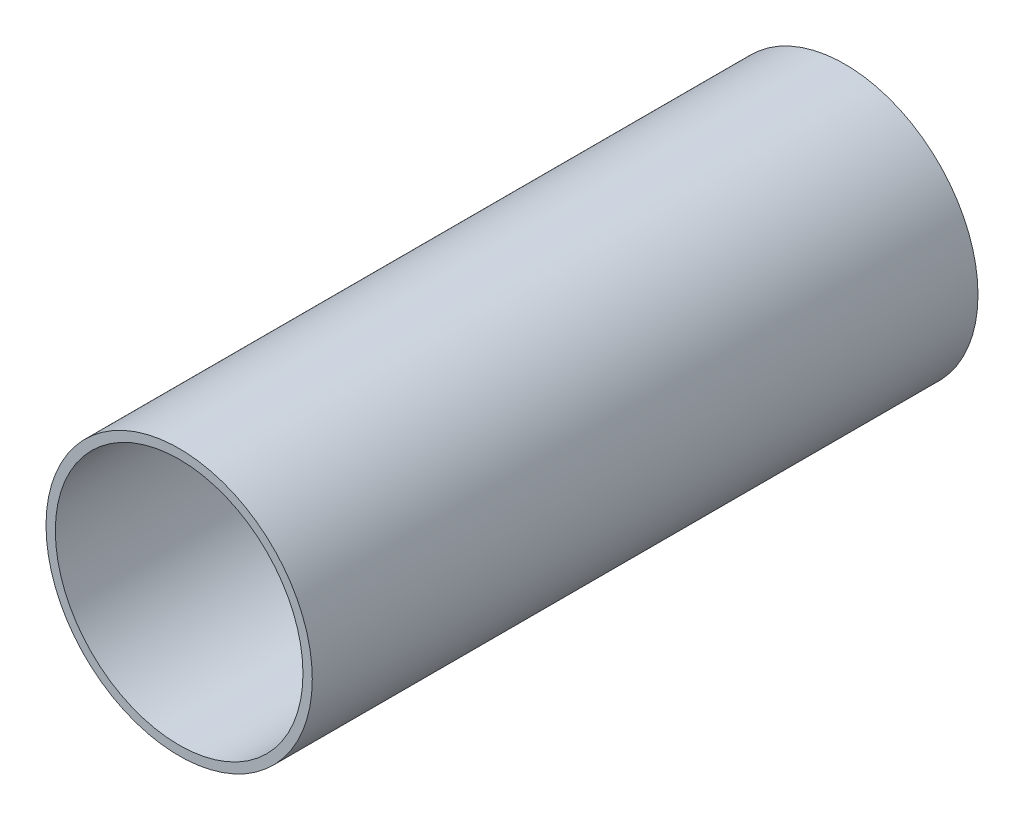
ISO-10303-21;
HEADER;
FILE_DESCRIPTION(('STEP AP214'),'2;1');
FILE_NAME('part.step','',(''),(''),'','','');
FILE_SCHEMA(('AUTOMOTIVE_DESIGN { 1 0 10303 214 1 1 1 1 }'));
ENDSEC;
DATA;
#1=APPLICATION_CONTEXT('core data for automotive mechanical design processes');
#2=APPLICATION_PROTOCOL_DEFINITION('international standard','automotive_design',2000,#1);
#3=PRODUCT_CONTEXT('',#1,'mechanical');
#4=PRODUCT('Part','Part','',(#3));
#5=PRODUCT_RELATED_PRODUCT_CATEGORY('part','',(#4));
#6=PRODUCT_DEFINITION_FORMATION('','',#4);
#7=PRODUCT_DEFINITION_CONTEXT('part definition',#1,'design');
#8=PRODUCT_DEFINITION('design','',#6,#7);
#9=PRODUCT_DEFINITION_SHAPE('','',#8);
#10=(LENGTH_UNIT() NAMED_UNIT(*) SI_UNIT(.MILLI.,.METRE.));
#11=(NAMED_UNIT(*) PLANE_ANGLE_UNIT() SI_UNIT($,.RADIAN.));
#12=(NAMED_UNIT(*) SI_UNIT($,.STERADIAN.) SOLID_ANGLE_UNIT());
#13=UNCERTAINTY_MEASURE_WITH_UNIT(LENGTH_MEASURE(1.E-05),#10,'distance_accuracy_value','');
#14=(GEOMETRIC_REPRESENTATION_CONTEXT(3) GLOBAL_UNCERTAINTY_ASSIGNED_CONTEXT((#13)) GLOBAL_UNIT_ASSIGNED_CONTEXT((#10,
#11,#12)) REPRESENTATION_CONTEXT('',''));
#15=CARTESIAN_POINT('',(0.,0.,0.));
#16=DIRECTION('',(0.,0.,1.));
#17=DIRECTION('',(1.,0.,0.));
#18=AXIS2_PLACEMENT_3D('',#15,#16,#17);
#19=CARTESIAN_POINT('',(0.,0.,31.75));
#20=DIRECTION('',(0.,0.,1.));
#21=DIRECTION('',(1.,0.,0.));
#22=AXIS2_PLACEMENT_3D('',#19,#20,#21);
#23=PLANE('',#22);
#24=CARTESIAN_POINT('',(0.,0.,31.75));
#25=DIRECTION('',(0.,0.,1.));
#26=DIRECTION('',(1.,0.,0.));
#27=AXIS2_PLACEMENT_3D('',#24,#25,#26);
#28=CIRCLE('',#27,12.7);
#29=CARTESIAN_POINT('',(12.7,0.,31.75));
#30=VERTEX_POINT('',#29);
#31=EDGE_CURVE('E10',#30,#30,#28,.T.);
#32=ORIENTED_EDGE('',*,*,#31,.T.);
#33=EDGE_LOOP('',(#32));
#34=FACE_BOUND('',#33,.T.);
#35=CARTESIAN_POINT('',(0.,0.,31.75));
#36=DIRECTION('',(0.,0.,1.));
#37=DIRECTION('',(1.,0.,0.));
#38=AXIS2_PLACEMENT_3D('',#35,#36,#37);
#39=CIRCLE('',#38,11.811);
#40=CARTESIAN_POINT('',(11.811,0.,31.75));
#41=VERTEX_POINT('',#40);
#42=EDGE_CURVE('E46',#41,#41,#39,.T.);
#43=ORIENTED_EDGE('',*,*,#42,.F.);
#44=EDGE_LOOP('',(#43));
#45=FACE_BOUND('',#44,.T.);
#46=ADVANCED_FACE('F35',(#34,#45),#23,.T.);
#47=CARTESIAN_POINT('',(0.,0.,-31.75));
#48=DIRECTION('',(0.,0.,1.));
#49=DIRECTION('',(1.,0.,0.));
#50=AXIS2_PLACEMENT_3D('',#47,#48,#49);
#51=PLANE('',#50);
#52=CARTESIAN_POINT('',(0.,0.,-31.75));
#53=DIRECTION('',(0.,0.,1.));
#54=DIRECTION('',(1.,0.,0.));
#55=AXIS2_PLACEMENT_3D('',#52,#53,#54);
#56=CIRCLE('',#55,12.7);
#57=CARTESIAN_POINT('',(12.7,0.,-31.75));
#58=VERTEX_POINT('',#57);
#59=EDGE_CURVE('E39',#58,#58,#56,.T.);
#60=ORIENTED_EDGE('',*,*,#59,.F.);
#61=EDGE_LOOP('',(#60));
#62=FACE_BOUND('',#61,.T.);
#63=CARTESIAN_POINT('',(0.,0.,-31.75));
#64=DIRECTION('',(0.,0.,1.));
#65=DIRECTION('',(1.,0.,0.));
#66=AXIS2_PLACEMENT_3D('',#63,#64,#65);
#67=CIRCLE('',#66,11.811);
#68=CARTESIAN_POINT('',(11.811,0.,-31.75));
#69=VERTEX_POINT('',#68);
#70=EDGE_CURVE('E48',#69,#69,#67,.T.);
#71=ORIENTED_EDGE('',*,*,#70,.T.);
#72=EDGE_LOOP('',(#71));
#73=FACE_BOUND('',#72,.T.);
#74=ADVANCED_FACE('F58',(#62,#73),#51,.F.);
#75=CARTESIAN_POINT('',(0.,0.,31.75));
#76=DIRECTION('',(0.,0.,-1.));
#77=DIRECTION('',(-1.,0.,0.));
#78=AXIS2_PLACEMENT_3D('',#75,#76,#77);
#79=CYLINDRICAL_SURFACE('',#78,12.7);
#80=ORIENTED_EDGE('',*,*,#31,.F.);
#81=EDGE_LOOP('',(#80));
#82=FACE_BOUND('',#81,.T.);
#83=ORIENTED_EDGE('',*,*,#59,.T.);
#84=EDGE_LOOP('',(#83));
#85=FACE_BOUND('',#84,.T.);
#86=ADVANCED_FACE('F37',(#82,#85),#79,.T.);
#87=CARTESIAN_POINT('',(0.,0.,31.75));
#88=DIRECTION('',(0.,0.,-1.));
#89=DIRECTION('',(-1.,0.,0.));
#90=AXIS2_PLACEMENT_3D('',#87,#88,#89);
#91=CYLINDRICAL_SURFACE('',#90,11.811);
#92=ORIENTED_EDGE('',*,*,#42,.T.);
#93=EDGE_LOOP('',(#92));
#94=FACE_BOUND('',#93,.T.);
#95=ORIENTED_EDGE('',*,*,#70,.F.);
#96=EDGE_LOOP('',(#95));
#97=FACE_BOUND('',#96,.T.);
#98=ADVANCED_FACE('F54',(#94,#97),#91,.F.);
#99=CLOSED_SHELL('',(#46,#74,#86,#98));
#100=MANIFOLD_SOLID_BREP('B2',#99);
#101=ADVANCED_BREP_SHAPE_REPRESENTATION('',(#18,#100),#14);
#102=SHAPE_DEFINITION_REPRESENTATION(#9,#101);
ENDSEC;
END-ISO-10303-21;
